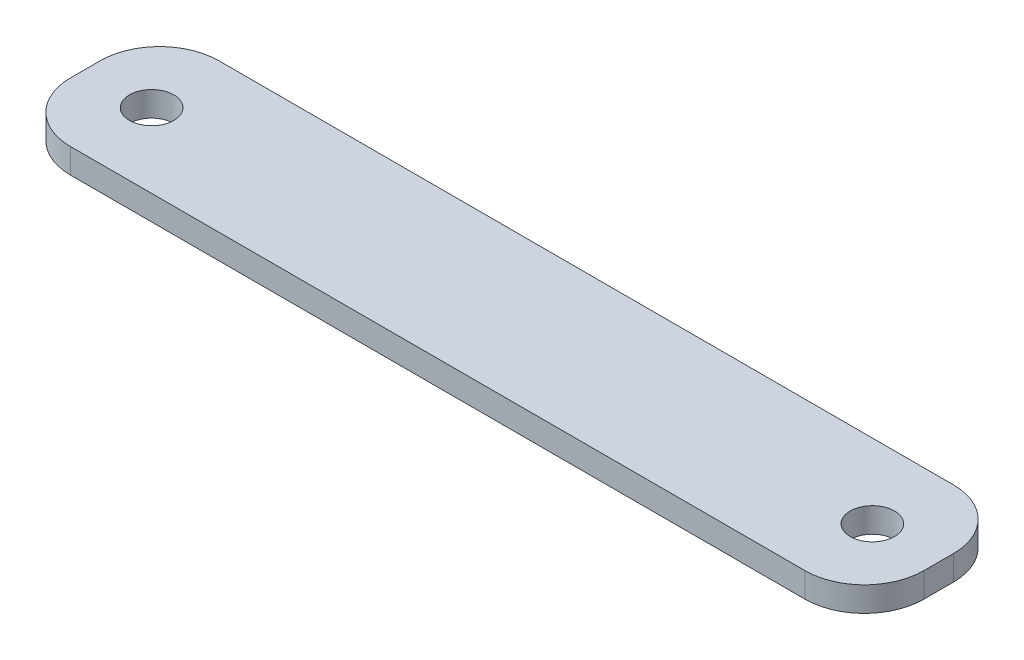
ISO-10303-21;
HEADER;
FILE_DESCRIPTION(('STEP AP214'),'2;1');
FILE_NAME('part.step','',(''),(''),'','','');
FILE_SCHEMA(('AUTOMOTIVE_DESIGN { 1 0 10303 214 1 1 1 1 }'));
ENDSEC;
DATA;
#1=APPLICATION_CONTEXT('core data for automotive mechanical design processes');
#2=APPLICATION_PROTOCOL_DEFINITION('international standard','automotive_design',2000,#1);
#3=PRODUCT_CONTEXT('',#1,'mechanical');
#4=PRODUCT('Part','Part','',(#3));
#5=PRODUCT_RELATED_PRODUCT_CATEGORY('part','',(#4));
#6=PRODUCT_DEFINITION_FORMATION('','',#4);
#7=PRODUCT_DEFINITION_CONTEXT('part definition',#1,'design');
#8=PRODUCT_DEFINITION('design','',#6,#7);
#9=PRODUCT_DEFINITION_SHAPE('','',#8);
#10=(LENGTH_UNIT() NAMED_UNIT(*) SI_UNIT(.MILLI.,.METRE.));
#11=(NAMED_UNIT(*) PLANE_ANGLE_UNIT() SI_UNIT($,.RADIAN.));
#12=(NAMED_UNIT(*) SI_UNIT($,.STERADIAN.) SOLID_ANGLE_UNIT());
#13=UNCERTAINTY_MEASURE_WITH_UNIT(LENGTH_MEASURE(1.E-05),#10,'distance_accuracy_value','');
#14=(GEOMETRIC_REPRESENTATION_CONTEXT(3) GLOBAL_UNCERTAINTY_ASSIGNED_CONTEXT((#13)) GLOBAL_UNIT_ASSIGNED_CONTEXT((#10,
#11,#12)) REPRESENTATION_CONTEXT('',''));
#15=CARTESIAN_POINT('',(0.,0.,0.));
#16=DIRECTION('',(0.,0.,1.));
#17=DIRECTION('',(1.,0.,0.));
#18=AXIS2_PLACEMENT_3D('',#15,#16,#17);
#19=CARTESIAN_POINT('',(0.,1.5875,0.));
#20=DIRECTION('',(1.,0.,0.));
#21=DIRECTION('',(0.,0.,-1.));
#22=AXIS2_PLACEMENT_3D('',#19,#20,#21);
#23=PLANE('',#22);
#24=DIRECTION('',(0.,0.,1.));
#25=VECTOR('',#24,1.);
#26=CARTESIAN_POINT('',(0.,1.5875,0.));
#27=LINE('',#26,#25);
#28=CARTESIAN_POINT('',(0.,1.5875,-5.715));
#29=VERTEX_POINT('',#28);
#30=CARTESIAN_POINT('',(0.,1.5875,-3.81));
#31=VERTEX_POINT('',#30);
#32=EDGE_CURVE('E132',#29,#31,#27,.T.);
#33=ORIENTED_EDGE('',*,*,#32,.F.);
#34=DIRECTION('',(0.,-1.,0.));
#35=VECTOR('',#34,1.);
#36=CARTESIAN_POINT('',(0.,1.5875,-5.715));
#37=LINE('',#36,#35);
#38=CARTESIAN_POINT('',(0.,0.,-5.715));
#39=VERTEX_POINT('',#38);
#40=EDGE_CURVE('E11',#29,#39,#37,.T.);
#41=ORIENTED_EDGE('',*,*,#40,.T.);
#42=DIRECTION('',(0.,0.,1.));
#43=VECTOR('',#42,1.);
#44=CARTESIAN_POINT('',(0.,0.,0.));
#45=LINE('',#44,#43);
#46=CARTESIAN_POINT('',(0.,0.,-3.81));
#47=VERTEX_POINT('',#46);
#48=EDGE_CURVE('E134',#39,#47,#45,.T.);
#49=ORIENTED_EDGE('',*,*,#48,.T.);
#50=DIRECTION('',(0.,-1.,0.));
#51=VECTOR('',#50,1.);
#52=CARTESIAN_POINT('',(0.,1.5875,-3.81));
#53=LINE('',#52,#51);
#54=EDGE_CURVE('E45',#47,#31,#53,.F.);
#55=ORIENTED_EDGE('',*,*,#54,.T.);
#56=EDGE_LOOP('',(#33,#41,#49,#55));
#57=FACE_BOUND('',#56,.T.);
#58=ADVANCED_FACE('F37',(#57),#23,.F.);
#59=CARTESIAN_POINT('',(0.,1.5875,0.));
#60=DIRECTION('',(0.,0.,-1.));
#61=DIRECTION('',(-1.,0.,0.));
#62=AXIS2_PLACEMENT_3D('',#59,#60,#61);
#63=PLANE('',#62);
#64=DIRECTION('',(1.,0.,0.));
#65=VECTOR('',#64,1.);
#66=CARTESIAN_POINT('',(0.,0.,0.));
#67=LINE('',#66,#65);
#68=CARTESIAN_POINT('',(3.81,0.,0.));
#69=VERTEX_POINT('',#68);
#70=CARTESIAN_POINT('',(50.927,0.,0.));
#71=VERTEX_POINT('',#70);
#72=EDGE_CURVE('E130',#69,#71,#67,.T.);
#73=ORIENTED_EDGE('',*,*,#72,.T.);
#74=DIRECTION('',(0.,-1.,0.));
#75=VECTOR('',#74,1.);
#76=CARTESIAN_POINT('',(50.927,1.5875,0.));
#77=LINE('',#76,#75);
#78=CARTESIAN_POINT('',(50.927,1.5875,0.));
#79=VERTEX_POINT('',#78);
#80=EDGE_CURVE('E109',#71,#79,#77,.F.);
#81=ORIENTED_EDGE('',*,*,#80,.T.);
#82=DIRECTION('',(1.,0.,0.));
#83=VECTOR('',#82,1.);
#84=CARTESIAN_POINT('',(0.,1.5875,0.));
#85=LINE('',#84,#83);
#86=CARTESIAN_POINT('',(3.81,1.5875,0.));
#87=VERTEX_POINT('',#86);
#88=EDGE_CURVE('E170',#87,#79,#85,.T.);
#89=ORIENTED_EDGE('',*,*,#88,.F.);
#90=DIRECTION('',(0.,-1.,0.));
#91=VECTOR('',#90,1.);
#92=CARTESIAN_POINT('',(3.81,1.5875,0.));
#93=LINE('',#92,#91);
#94=EDGE_CURVE('E114',#87,#69,#93,.T.);
#95=ORIENTED_EDGE('',*,*,#94,.T.);
#96=EDGE_LOOP('',(#73,#81,#89,#95));
#97=FACE_BOUND('',#96,.T.);
#98=ADVANCED_FACE('F174',(#97),#63,.F.);
#99=CARTESIAN_POINT('',(54.737,1.5875,0.));
#100=DIRECTION('',(-1.,0.,0.));
#101=DIRECTION('',(0.,0.,1.));
#102=AXIS2_PLACEMENT_3D('',#99,#100,#101);
#103=PLANE('',#102);
#104=DIRECTION('',(0.,0.,-1.));
#105=VECTOR('',#104,1.);
#106=CARTESIAN_POINT('',(54.737,1.5875,0.));
#107=LINE('',#106,#105);
#108=CARTESIAN_POINT('',(54.737,1.5875,-3.81));
#109=VERTEX_POINT('',#108);
#110=CARTESIAN_POINT('',(54.737,1.5875,-5.715));
#111=VERTEX_POINT('',#110);
#112=EDGE_CURVE('E123',#109,#111,#107,.T.);
#113=ORIENTED_EDGE('',*,*,#112,.F.);
#114=DIRECTION('',(0.,-1.,0.));
#115=VECTOR('',#114,1.);
#116=CARTESIAN_POINT('',(54.737,1.5875,-3.81));
#117=LINE('',#116,#115);
#118=CARTESIAN_POINT('',(54.737,0.,-3.81));
#119=VERTEX_POINT('',#118);
#120=EDGE_CURVE('E108',#109,#119,#117,.T.);
#121=ORIENTED_EDGE('',*,*,#120,.T.);
#122=DIRECTION('',(0.,0.,-1.));
#123=VECTOR('',#122,1.);
#124=CARTESIAN_POINT('',(54.737,0.,0.));
#125=LINE('',#124,#123);
#126=CARTESIAN_POINT('',(54.737,0.,-5.715));
#127=VERTEX_POINT('',#126);
#128=EDGE_CURVE('E121',#119,#127,#125,.T.);
#129=ORIENTED_EDGE('',*,*,#128,.T.);
#130=DIRECTION('',(0.,-1.,0.));
#131=VECTOR('',#130,1.);
#132=CARTESIAN_POINT('',(54.737,1.5875,-5.715));
#133=LINE('',#132,#131);
#134=EDGE_CURVE('E125',#127,#111,#133,.F.);
#135=ORIENTED_EDGE('',*,*,#134,.T.);
#136=EDGE_LOOP('',(#113,#121,#129,#135));
#137=FACE_BOUND('',#136,.T.);
#138=ADVANCED_FACE('F120',(#137),#103,.F.);
#139=CARTESIAN_POINT('',(0.,1.5875,-9.525));
#140=DIRECTION('',(0.,0.,1.));
#141=DIRECTION('',(1.,0.,0.));
#142=AXIS2_PLACEMENT_3D('',#139,#140,#141);
#143=PLANE('',#142);
#144=DIRECTION('',(-1.,0.,0.));
#145=VECTOR('',#144,1.);
#146=CARTESIAN_POINT('',(0.,1.5875,-9.525));
#147=LINE('',#146,#145);
#148=CARTESIAN_POINT('',(50.927,1.5875,-9.525));
#149=VERTEX_POINT('',#148);
#150=CARTESIAN_POINT('',(3.81,1.5875,-9.525));
#151=VERTEX_POINT('',#150);
#152=EDGE_CURVE('E138',#149,#151,#147,.T.);
#153=ORIENTED_EDGE('',*,*,#152,.F.);
#154=DIRECTION('',(0.,-1.,0.));
#155=VECTOR('',#154,1.);
#156=CARTESIAN_POINT('',(50.927,1.5875,-9.525));
#157=LINE('',#156,#155);
#158=CARTESIAN_POINT('',(50.927,0.,-9.525));
#159=VERTEX_POINT('',#158);
#160=EDGE_CURVE('E155',#149,#159,#157,.T.);
#161=ORIENTED_EDGE('',*,*,#160,.T.);
#162=DIRECTION('',(-1.,0.,0.));
#163=VECTOR('',#162,1.);
#164=CARTESIAN_POINT('',(0.,0.,-9.525));
#165=LINE('',#164,#163);
#166=CARTESIAN_POINT('',(3.81,0.,-9.525));
#167=VERTEX_POINT('',#166);
#168=EDGE_CURVE('E129',#159,#167,#165,.T.);
#169=ORIENTED_EDGE('',*,*,#168,.T.);
#170=DIRECTION('',(0.,-1.,0.));
#171=VECTOR('',#170,1.);
#172=CARTESIAN_POINT('',(3.81,1.5875,-9.525));
#173=LINE('',#172,#171);
#174=EDGE_CURVE('E52',#167,#151,#173,.F.);
#175=ORIENTED_EDGE('',*,*,#174,.T.);
#176=EDGE_LOOP('',(#153,#161,#169,#175));
#177=FACE_BOUND('',#176,.T.);
#178=ADVANCED_FACE('F203',(#177),#143,.F.);
#179=CARTESIAN_POINT('',(0.,1.5875,-9.525));
#180=DIRECTION('',(0.,-1.,0.));
#181=DIRECTION('',(0.,0.,-1.));
#182=AXIS2_PLACEMENT_3D('',#179,#180,#181);
#183=PLANE('',#182);
#184=CARTESIAN_POINT('',(50.4825,1.5875,-4.7625));
#185=DIRECTION('',(0.,1.,0.));
#186=DIRECTION('',(0.,0.,1.));
#187=AXIS2_PLACEMENT_3D('',#184,#185,#186);
#188=CIRCLE('',#187,1.42239999999999);
#189=CARTESIAN_POINT('',(50.4825,1.5875,-3.34010000000001));
#190=VERTEX_POINT('',#189);
#191=EDGE_CURVE('E186',#190,#190,#188,.T.);
#192=ORIENTED_EDGE('',*,*,#191,.F.);
#193=EDGE_LOOP('',(#192));
#194=FACE_BOUND('',#193,.T.);
#195=CARTESIAN_POINT('',(4.25449999999999,1.5875,-4.7625));
#196=DIRECTION('',(0.,1.,0.));
#197=DIRECTION('',(0.,0.,1.));
#198=AXIS2_PLACEMENT_3D('',#195,#196,#197);
#199=CIRCLE('',#198,1.4224);
#200=CARTESIAN_POINT('',(4.25449999999999,1.5875,-3.3401));
#201=VERTEX_POINT('',#200);
#202=EDGE_CURVE('E177',#201,#201,#199,.T.);
#203=ORIENTED_EDGE('',*,*,#202,.F.);
#204=EDGE_LOOP('',(#203));
#205=FACE_BOUND('',#204,.T.);
#206=ORIENTED_EDGE('',*,*,#88,.T.);
#207=CARTESIAN_POINT('',(50.927,1.5875,-3.81));
#208=DIRECTION('',(0.,-1.,0.));
#209=DIRECTION('',(0.,0.,-1.));
#210=AXIS2_PLACEMENT_3D('',#207,#208,#209);
#211=CIRCLE('',#210,3.81);
#212=EDGE_CURVE('E152',#79,#109,#211,.F.);
#213=ORIENTED_EDGE('',*,*,#212,.T.);
#214=ORIENTED_EDGE('',*,*,#112,.T.);
#215=CARTESIAN_POINT('',(50.927,1.5875,-5.715));
#216=DIRECTION('',(0.,-1.,0.));
#217=DIRECTION('',(0.,0.,-1.));
#218=AXIS2_PLACEMENT_3D('',#215,#216,#217);
#219=CIRCLE('',#218,3.81);
#220=EDGE_CURVE('E59',#111,#149,#219,.F.);
#221=ORIENTED_EDGE('',*,*,#220,.T.);
#222=ORIENTED_EDGE('',*,*,#152,.T.);
#223=CARTESIAN_POINT('',(3.81,1.5875,-5.715));
#224=DIRECTION('',(0.,-1.,0.));
#225=DIRECTION('',(0.,0.,-1.));
#226=AXIS2_PLACEMENT_3D('',#223,#224,#225);
#227=CIRCLE('',#226,3.81);
#228=EDGE_CURVE('E149',#151,#29,#227,.F.);
#229=ORIENTED_EDGE('',*,*,#228,.T.);
#230=ORIENTED_EDGE('',*,*,#32,.T.);
#231=CARTESIAN_POINT('',(3.81,1.5875,-3.81));
#232=DIRECTION('',(0.,-1.,0.));
#233=DIRECTION('',(0.,0.,-1.));
#234=AXIS2_PLACEMENT_3D('',#231,#232,#233);
#235=CIRCLE('',#234,3.81);
#236=EDGE_CURVE('E147',#31,#87,#235,.F.);
#237=ORIENTED_EDGE('',*,*,#236,.T.);
#238=EDGE_LOOP('',(#206,#213,#214,#221,#222,#229,#230,#237));
#239=FACE_BOUND('',#238,.T.);
#240=ADVANCED_FACE('F167',(#194,#205,#239),#183,.F.);
#241=CARTESIAN_POINT('',(0.,0.,-9.525));
#242=DIRECTION('',(0.,-1.,0.));
#243=DIRECTION('',(0.,0.,-1.));
#244=AXIS2_PLACEMENT_3D('',#241,#242,#243);
#245=PLANE('',#244);
#246=CARTESIAN_POINT('',(50.4825,0.,-4.7625));
#247=DIRECTION('',(0.,1.,0.));
#248=DIRECTION('',(0.,0.,1.));
#249=AXIS2_PLACEMENT_3D('',#246,#247,#248);
#250=CIRCLE('',#249,1.42239999999999);
#251=CARTESIAN_POINT('',(50.4825,0.,-3.34010000000001));
#252=VERTEX_POINT('',#251);
#253=EDGE_CURVE('E184',#252,#252,#250,.T.);
#254=ORIENTED_EDGE('',*,*,#253,.T.);
#255=EDGE_LOOP('',(#254));
#256=FACE_BOUND('',#255,.T.);
#257=CARTESIAN_POINT('',(4.25449999999999,0.,-4.7625));
#258=DIRECTION('',(0.,1.,0.));
#259=DIRECTION('',(0.,0.,1.));
#260=AXIS2_PLACEMENT_3D('',#257,#258,#259);
#261=CIRCLE('',#260,1.4224);
#262=CARTESIAN_POINT('',(4.25449999999999,0.,-3.3401));
#263=VERTEX_POINT('',#262);
#264=EDGE_CURVE('E175',#263,#263,#261,.T.);
#265=ORIENTED_EDGE('',*,*,#264,.T.);
#266=EDGE_LOOP('',(#265));
#267=FACE_BOUND('',#266,.T.);
#268=ORIENTED_EDGE('',*,*,#128,.F.);
#269=CARTESIAN_POINT('',(50.927,0.,-3.81));
#270=DIRECTION('',(0.,-1.,0.));
#271=DIRECTION('',(0.,0.,-1.));
#272=AXIS2_PLACEMENT_3D('',#269,#270,#271);
#273=CIRCLE('',#272,3.81);
#274=EDGE_CURVE('E104',#119,#71,#273,.T.);
#275=ORIENTED_EDGE('',*,*,#274,.T.);
#276=ORIENTED_EDGE('',*,*,#72,.F.);
#277=CARTESIAN_POINT('',(3.81,0.,-3.81));
#278=DIRECTION('',(0.,-1.,0.));
#279=DIRECTION('',(0.,0.,-1.));
#280=AXIS2_PLACEMENT_3D('',#277,#278,#279);
#281=CIRCLE('',#280,3.81);
#282=EDGE_CURVE('E124',#69,#47,#281,.T.);
#283=ORIENTED_EDGE('',*,*,#282,.T.);
#284=ORIENTED_EDGE('',*,*,#48,.F.);
#285=CARTESIAN_POINT('',(3.81,0.,-5.715));
#286=DIRECTION('',(0.,-1.,0.));
#287=DIRECTION('',(0.,0.,-1.));
#288=AXIS2_PLACEMENT_3D('',#285,#286,#287);
#289=CIRCLE('',#288,3.81);
#290=EDGE_CURVE('E141',#39,#167,#289,.T.);
#291=ORIENTED_EDGE('',*,*,#290,.T.);
#292=ORIENTED_EDGE('',*,*,#168,.F.);
#293=CARTESIAN_POINT('',(50.927,0.,-5.715));
#294=DIRECTION('',(0.,-1.,0.));
#295=DIRECTION('',(0.,0.,-1.));
#296=AXIS2_PLACEMENT_3D('',#293,#294,#295);
#297=CIRCLE('',#296,3.81);
#298=EDGE_CURVE('E115',#159,#127,#297,.T.);
#299=ORIENTED_EDGE('',*,*,#298,.T.);
#300=EDGE_LOOP('',(#268,#275,#276,#283,#284,#291,#292,#299));
#301=FACE_BOUND('',#300,.T.);
#302=ADVANCED_FACE('F127',(#256,#267,#301),#245,.T.);
#303=CARTESIAN_POINT('',(50.927,1.5875,-3.81));
#304=DIRECTION('',(0.,-1.,0.));
#305=DIRECTION('',(0.,0.,-1.));
#306=AXIS2_PLACEMENT_3D('',#303,#304,#305);
#307=CYLINDRICAL_SURFACE('',#306,3.81);
#308=ORIENTED_EDGE('',*,*,#212,.F.);
#309=ORIENTED_EDGE('',*,*,#80,.F.);
#310=ORIENTED_EDGE('',*,*,#274,.F.);
#311=ORIENTED_EDGE('',*,*,#120,.F.);
#312=EDGE_LOOP('',(#308,#309,#310,#311));
#313=FACE_BOUND('',#312,.T.);
#314=ADVANCED_FACE('F107',(#313),#307,.T.);
#315=CARTESIAN_POINT('',(50.927,1.5875,-5.715));
#316=DIRECTION('',(0.,-1.,0.));
#317=DIRECTION('',(0.,0.,-1.));
#318=AXIS2_PLACEMENT_3D('',#315,#316,#317);
#319=CYLINDRICAL_SURFACE('',#318,3.81);
#320=ORIENTED_EDGE('',*,*,#220,.F.);
#321=ORIENTED_EDGE('',*,*,#134,.F.);
#322=ORIENTED_EDGE('',*,*,#298,.F.);
#323=ORIENTED_EDGE('',*,*,#160,.F.);
#324=EDGE_LOOP('',(#320,#321,#322,#323));
#325=FACE_BOUND('',#324,.T.);
#326=ADVANCED_FACE('F225',(#325),#319,.T.);
#327=CARTESIAN_POINT('',(3.81,1.5875,-5.715));
#328=DIRECTION('',(0.,-1.,0.));
#329=DIRECTION('',(0.,0.,-1.));
#330=AXIS2_PLACEMENT_3D('',#327,#328,#329);
#331=CYLINDRICAL_SURFACE('',#330,3.81);
#332=ORIENTED_EDGE('',*,*,#228,.F.);
#333=ORIENTED_EDGE('',*,*,#174,.F.);
#334=ORIENTED_EDGE('',*,*,#290,.F.);
#335=ORIENTED_EDGE('',*,*,#40,.F.);
#336=EDGE_LOOP('',(#332,#333,#334,#335));
#337=FACE_BOUND('',#336,.T.);
#338=ADVANCED_FACE('F213',(#337),#331,.T.);
#339=CARTESIAN_POINT('',(3.81,1.5875,-3.81));
#340=DIRECTION('',(0.,-1.,0.));
#341=DIRECTION('',(0.,0.,-1.));
#342=AXIS2_PLACEMENT_3D('',#339,#340,#341);
#343=CYLINDRICAL_SURFACE('',#342,3.81);
#344=ORIENTED_EDGE('',*,*,#236,.F.);
#345=ORIENTED_EDGE('',*,*,#54,.F.);
#346=ORIENTED_EDGE('',*,*,#282,.F.);
#347=ORIENTED_EDGE('',*,*,#94,.F.);
#348=EDGE_LOOP('',(#344,#345,#346,#347));
#349=FACE_BOUND('',#348,.T.);
#350=ADVANCED_FACE('F39',(#349),#343,.T.);
#351=CARTESIAN_POINT('',(4.25449999999999,0.,-4.7625));
#352=DIRECTION('',(0.,1.,0.));
#353=DIRECTION('',(0.,0.,1.));
#354=AXIS2_PLACEMENT_3D('',#351,#352,#353);
#355=CYLINDRICAL_SURFACE('',#354,1.4224);
#356=ORIENTED_EDGE('',*,*,#264,.F.);
#357=EDGE_LOOP('',(#356));
#358=FACE_BOUND('',#357,.T.);
#359=ORIENTED_EDGE('',*,*,#202,.T.);
#360=EDGE_LOOP('',(#359));
#361=FACE_BOUND('',#360,.T.);
#362=ADVANCED_FACE('F197',(#358,#361),#355,.F.);
#363=CARTESIAN_POINT('',(50.4825,0.,-4.7625));
#364=DIRECTION('',(0.,1.,0.));
#365=DIRECTION('',(0.,0.,1.));
#366=AXIS2_PLACEMENT_3D('',#363,#364,#365);
#367=CYLINDRICAL_SURFACE('',#366,1.42239999999999);
#368=ORIENTED_EDGE('',*,*,#253,.F.);
#369=EDGE_LOOP('',(#368));
#370=FACE_BOUND('',#369,.T.);
#371=ORIENTED_EDGE('',*,*,#191,.T.);
#372=EDGE_LOOP('',(#371));
#373=FACE_BOUND('',#372,.T.);
#374=ADVANCED_FACE('F194',(#370,#373),#367,.F.);
#375=CLOSED_SHELL('',(#58,#98,#138,#178,#240,#302,#314,#326,#338,#350,#362,#374));
#376=MANIFOLD_SOLID_BREP('B2',#375);
#377=ADVANCED_BREP_SHAPE_REPRESENTATION('',(#18,#376),#14);
#378=SHAPE_DEFINITION_REPRESENTATION(#9,#377);
ENDSEC;
END-ISO-10303-21;
